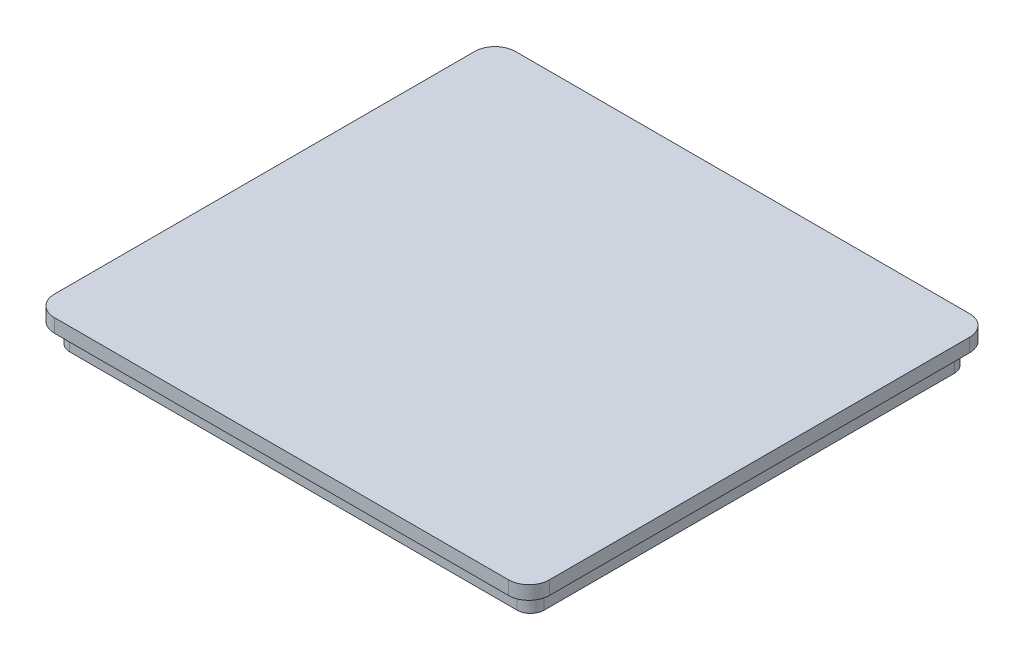
ISO-10303-21;
HEADER;
FILE_DESCRIPTION(('STEP AP214'),'2;1');
FILE_NAME('part.step','',(''),(''),'','','');
FILE_SCHEMA(('AUTOMOTIVE_DESIGN { 1 0 10303 214 1 1 1 1 }'));
ENDSEC;
DATA;
#1=APPLICATION_CONTEXT('core data for automotive mechanical design processes');
#2=APPLICATION_PROTOCOL_DEFINITION('international standard','automotive_design',2000,#1);
#3=PRODUCT_CONTEXT('',#1,'mechanical');
#4=PRODUCT('Part','Part','',(#3));
#5=PRODUCT_RELATED_PRODUCT_CATEGORY('part','',(#4));
#6=PRODUCT_DEFINITION_FORMATION('','',#4);
#7=PRODUCT_DEFINITION_CONTEXT('part definition',#1,'design');
#8=PRODUCT_DEFINITION('design','',#6,#7);
#9=PRODUCT_DEFINITION_SHAPE('','',#8);
#10=(LENGTH_UNIT() NAMED_UNIT(*) SI_UNIT(.MILLI.,.METRE.));
#11=(NAMED_UNIT(*) PLANE_ANGLE_UNIT() SI_UNIT($,.RADIAN.));
#12=(NAMED_UNIT(*) SI_UNIT($,.STERADIAN.) SOLID_ANGLE_UNIT());
#13=UNCERTAINTY_MEASURE_WITH_UNIT(LENGTH_MEASURE(1.E-05),#10,'distance_accuracy_value','');
#14=(GEOMETRIC_REPRESENTATION_CONTEXT(3) GLOBAL_UNCERTAINTY_ASSIGNED_CONTEXT((#13)) GLOBAL_UNIT_ASSIGNED_CONTEXT((#10,
#11,#12)) REPRESENTATION_CONTEXT('',''));
#15=CARTESIAN_POINT('',(0.,0.,0.));
#16=DIRECTION('',(0.,0.,1.));
#17=DIRECTION('',(1.,0.,0.));
#18=AXIS2_PLACEMENT_3D('',#15,#16,#17);
#19=CARTESIAN_POINT('',(-35.,3.,51.2682926829268));
#20=DIRECTION('',(1.,0.,0.));
#21=DIRECTION('',(0.,0.,-1.));
#22=AXIS2_PLACEMENT_3D('',#19,#20,#21);
#23=PLANE('',#22);
#24=DIRECTION('',(0.,0.,1.));
#25=VECTOR('',#24,1.);
#26=CARTESIAN_POINT('',(-35.,3.,51.2682926829268));
#27=LINE('',#26,#25);
#28=CARTESIAN_POINT('',(-35.,3.,-11.2317073170732));
#29=VERTEX_POINT('',#28);
#30=CARTESIAN_POINT('',(-35.,3.,49.2682926829268));
#31=VERTEX_POINT('',#30);
#32=EDGE_CURVE('E266',#29,#31,#27,.T.);
#33=ORIENTED_EDGE('',*,*,#32,.F.);
#34=DIRECTION('',(0.,-1.,0.));
#35=VECTOR('',#34,1.);
#36=CARTESIAN_POINT('',(-35.,3.,-11.2317073170732));
#37=LINE('',#36,#35);
#38=CARTESIAN_POINT('',(-35.,0.,-11.2317073170732));
#39=VERTEX_POINT('',#38);
#40=EDGE_CURVE('E299',#29,#39,#37,.T.);
#41=ORIENTED_EDGE('',*,*,#40,.T.);
#42=DIRECTION('',(0.,0.,1.));
#43=VECTOR('',#42,1.);
#44=CARTESIAN_POINT('',(-35.,0.,51.2682926829268));
#45=LINE('',#44,#43);
#46=CARTESIAN_POINT('',(-35.,0.,49.2682926829268));
#47=VERTEX_POINT('',#46);
#48=EDGE_CURVE('E238',#39,#47,#45,.T.);
#49=ORIENTED_EDGE('',*,*,#48,.T.);
#50=DIRECTION('',(0.,-1.,0.));
#51=VECTOR('',#50,1.);
#52=CARTESIAN_POINT('',(-35.,3.,49.2682926829268));
#53=LINE('',#52,#51);
#54=EDGE_CURVE('E283',#47,#31,#53,.F.);
#55=ORIENTED_EDGE('',*,*,#54,.T.);
#56=EDGE_LOOP('',(#33,#41,#49,#55));
#57=FACE_BOUND('',#56,.T.);
#58=ADVANCED_FACE('F47',(#57),#23,.F.);
#59=CARTESIAN_POINT('',(35.,3.,51.2682926829268));
#60=DIRECTION('',(0.,0.,-1.));
#61=DIRECTION('',(-1.,0.,0.));
#62=AXIS2_PLACEMENT_3D('',#59,#60,#61);
#63=PLANE('',#62);
#64=DIRECTION('',(1.,0.,0.));
#65=VECTOR('',#64,1.);
#66=CARTESIAN_POINT('',(35.,0.,51.2682926829268));
#67=LINE('',#66,#65);
#68=CARTESIAN_POINT('',(-33.,0.,51.2682926829268));
#69=VERTEX_POINT('',#68);
#70=CARTESIAN_POINT('',(33.,0.,51.2682926829268));
#71=VERTEX_POINT('',#70);
#72=EDGE_CURVE('E287',#69,#71,#67,.T.);
#73=ORIENTED_EDGE('',*,*,#72,.T.);
#74=DIRECTION('',(0.,-1.,0.));
#75=VECTOR('',#74,1.);
#76=CARTESIAN_POINT('',(33.,3.,51.2682926829268));
#77=LINE('',#76,#75);
#78=CARTESIAN_POINT('',(33.,3.,51.2682926829268));
#79=VERTEX_POINT('',#78);
#80=EDGE_CURVE('E11',#71,#79,#77,.F.);
#81=ORIENTED_EDGE('',*,*,#80,.T.);
#82=DIRECTION('',(1.,0.,0.));
#83=VECTOR('',#82,1.);
#84=CARTESIAN_POINT('',(35.,3.,51.2682926829268));
#85=LINE('',#84,#83);
#86=CARTESIAN_POINT('',(-33.,3.,51.2682926829268));
#87=VERTEX_POINT('',#86);
#88=EDGE_CURVE('E270',#87,#79,#85,.T.);
#89=ORIENTED_EDGE('',*,*,#88,.F.);
#90=DIRECTION('',(0.,-1.,0.));
#91=VECTOR('',#90,1.);
#92=CARTESIAN_POINT('',(-33.,3.,51.2682926829268));
#93=LINE('',#92,#91);
#94=EDGE_CURVE('E56',#87,#69,#93,.T.);
#95=ORIENTED_EDGE('',*,*,#94,.T.);
#96=EDGE_LOOP('',(#73,#81,#89,#95));
#97=FACE_BOUND('',#96,.T.);
#98=ADVANCED_FACE('F348',(#97),#63,.F.);
#99=CARTESIAN_POINT('',(35.,3.,51.2682926829268));
#100=DIRECTION('',(-1.,0.,0.));
#101=DIRECTION('',(0.,0.,1.));
#102=AXIS2_PLACEMENT_3D('',#99,#100,#101);
#103=PLANE('',#102);
#104=DIRECTION('',(0.,0.,-1.));
#105=VECTOR('',#104,1.);
#106=CARTESIAN_POINT('',(35.,0.,51.2682926829268));
#107=LINE('',#106,#105);
#108=CARTESIAN_POINT('',(35.,0.,49.2682926829268));
#109=VERTEX_POINT('',#108);
#110=CARTESIAN_POINT('',(35.,0.,-11.2317073170732));
#111=VERTEX_POINT('',#110);
#112=EDGE_CURVE('E291',#109,#111,#107,.T.);
#113=ORIENTED_EDGE('',*,*,#112,.T.);
#114=DIRECTION('',(0.,-1.,0.));
#115=VECTOR('',#114,1.);
#116=CARTESIAN_POINT('',(35.,3.,-11.2317073170732));
#117=LINE('',#116,#115);
#118=CARTESIAN_POINT('',(35.,3.,-11.2317073170732));
#119=VERTEX_POINT('',#118);
#120=EDGE_CURVE('E71',#111,#119,#117,.F.);
#121=ORIENTED_EDGE('',*,*,#120,.T.);
#122=DIRECTION('',(0.,0.,-1.));
#123=VECTOR('',#122,1.);
#124=CARTESIAN_POINT('',(35.,3.,51.2682926829268));
#125=LINE('',#124,#123);
#126=CARTESIAN_POINT('',(35.,3.,49.2682926829268));
#127=VERTEX_POINT('',#126);
#128=EDGE_CURVE('E275',#127,#119,#125,.T.);
#129=ORIENTED_EDGE('',*,*,#128,.F.);
#130=DIRECTION('',(0.,-1.,0.));
#131=VECTOR('',#130,1.);
#132=CARTESIAN_POINT('',(35.,3.,49.2682926829268));
#133=LINE('',#132,#131);
#134=EDGE_CURVE('E338',#127,#109,#133,.T.);
#135=ORIENTED_EDGE('',*,*,#134,.T.);
#136=EDGE_LOOP('',(#113,#121,#129,#135));
#137=FACE_BOUND('',#136,.T.);
#138=ADVANCED_FACE('F360',(#137),#103,.F.);
#139=CARTESIAN_POINT('',(35.,3.,-13.2317073170732));
#140=DIRECTION('',(0.,0.,1.));
#141=DIRECTION('',(1.,0.,0.));
#142=AXIS2_PLACEMENT_3D('',#139,#140,#141);
#143=PLANE('',#142);
#144=DIRECTION('',(-1.,0.,0.));
#145=VECTOR('',#144,1.);
#146=CARTESIAN_POINT('',(35.,0.,-13.2317073170732));
#147=LINE('',#146,#145);
#148=CARTESIAN_POINT('',(33.,0.,-13.2317073170732));
#149=VERTEX_POINT('',#148);
#150=CARTESIAN_POINT('',(-33.,0.,-13.2317073170732));
#151=VERTEX_POINT('',#150);
#152=EDGE_CURVE('E271',#149,#151,#147,.T.);
#153=ORIENTED_EDGE('',*,*,#152,.T.);
#154=DIRECTION('',(0.,-1.,0.));
#155=VECTOR('',#154,1.);
#156=CARTESIAN_POINT('',(-33.,3.,-13.2317073170732));
#157=LINE('',#156,#155);
#158=CARTESIAN_POINT('',(-33.,3.,-13.2317073170732));
#159=VERTEX_POINT('',#158);
#160=EDGE_CURVE('E319',#151,#159,#157,.F.);
#161=ORIENTED_EDGE('',*,*,#160,.T.);
#162=DIRECTION('',(-1.,0.,0.));
#163=VECTOR('',#162,1.);
#164=CARTESIAN_POINT('',(35.,3.,-13.2317073170732));
#165=LINE('',#164,#163);
#166=CARTESIAN_POINT('',(33.,3.,-13.2317073170732));
#167=VERTEX_POINT('',#166);
#168=EDGE_CURVE('E279',#167,#159,#165,.T.);
#169=ORIENTED_EDGE('',*,*,#168,.F.);
#170=DIRECTION('',(0.,-1.,0.));
#171=VECTOR('',#170,1.);
#172=CARTESIAN_POINT('',(33.,3.,-13.2317073170732));
#173=LINE('',#172,#171);
#174=EDGE_CURVE('E315',#167,#149,#173,.T.);
#175=ORIENTED_EDGE('',*,*,#174,.T.);
#176=EDGE_LOOP('',(#153,#161,#169,#175));
#177=FACE_BOUND('',#176,.T.);
#178=ADVANCED_FACE('F371',(#177),#143,.F.);
#179=CARTESIAN_POINT('',(0.,0.,0.));
#180=DIRECTION('',(0.,1.,0.));
#181=DIRECTION('',(0.,0.,1.));
#182=AXIS2_PLACEMENT_3D('',#179,#180,#181);
#183=PLANE('',#182);
#184=DIRECTION('',(-1.,0.,0.));
#185=VECTOR('',#184,1.);
#186=CARTESIAN_POINT('',(35.,0.,-11.2317073170732));
#187=LINE('',#186,#185);
#188=CARTESIAN_POINT('',(33.,0.,-11.2317073170732));
#189=VERTEX_POINT('',#188);
#190=CARTESIAN_POINT('',(-33.,0.,-11.2317073170732));
#191=VERTEX_POINT('',#190);
#192=EDGE_CURVE('E247',#189,#191,#187,.T.);
#193=ORIENTED_EDGE('',*,*,#192,.T.);
#194=DIRECTION('',(0.,0.,1.));
#195=VECTOR('',#194,1.);
#196=CARTESIAN_POINT('',(-33.,0.,51.2682926829268));
#197=LINE('',#196,#195);
#198=CARTESIAN_POINT('',(-33.,0.,49.2682926829268));
#199=VERTEX_POINT('',#198);
#200=EDGE_CURVE('E214',#191,#199,#197,.T.);
#201=ORIENTED_EDGE('',*,*,#200,.T.);
#202=DIRECTION('',(1.,0.,0.));
#203=VECTOR('',#202,1.);
#204=CARTESIAN_POINT('',(35.,0.,49.2682926829268));
#205=LINE('',#204,#203);
#206=CARTESIAN_POINT('',(33.,0.,49.2682926829268));
#207=VERTEX_POINT('',#206);
#208=EDGE_CURVE('E219',#199,#207,#205,.T.);
#209=ORIENTED_EDGE('',*,*,#208,.T.);
#210=DIRECTION('',(0.,0.,-1.));
#211=VECTOR('',#210,1.);
#212=CARTESIAN_POINT('',(33.,0.,51.2682926829268));
#213=LINE('',#212,#211);
#214=EDGE_CURVE('E63',#207,#189,#213,.T.);
#215=ORIENTED_EDGE('',*,*,#214,.T.);
#216=EDGE_LOOP('',(#193,#201,#209,#215));
#217=FACE_BOUND('',#216,.T.);
#218=ORIENTED_EDGE('',*,*,#48,.F.);
#219=CARTESIAN_POINT('',(-33.,0.,-11.2317073170732));
#220=DIRECTION('',(0.,1.,0.));
#221=DIRECTION('',(0.,0.,1.));
#222=AXIS2_PLACEMENT_3D('',#219,#220,#221);
#223=CIRCLE('',#222,2.);
#224=EDGE_CURVE('E312',#39,#151,#223,.F.);
#225=ORIENTED_EDGE('',*,*,#224,.T.);
#226=ORIENTED_EDGE('',*,*,#152,.F.);
#227=CARTESIAN_POINT('',(33.,0.,-11.2317073170732));
#228=DIRECTION('',(0.,1.,0.));
#229=DIRECTION('',(0.,0.,1.));
#230=AXIS2_PLACEMENT_3D('',#227,#228,#229);
#231=CIRCLE('',#230,2.);
#232=EDGE_CURVE('E309',#149,#111,#231,.F.);
#233=ORIENTED_EDGE('',*,*,#232,.T.);
#234=ORIENTED_EDGE('',*,*,#112,.F.);
#235=CARTESIAN_POINT('',(33.,0.,49.2682926829268));
#236=DIRECTION('',(0.,1.,0.));
#237=DIRECTION('',(0.,0.,1.));
#238=AXIS2_PLACEMENT_3D('',#235,#236,#237);
#239=CIRCLE('',#238,2.);
#240=EDGE_CURVE('E306',#109,#71,#239,.F.);
#241=ORIENTED_EDGE('',*,*,#240,.T.);
#242=ORIENTED_EDGE('',*,*,#72,.F.);
#243=CARTESIAN_POINT('',(-33.,0.,49.2682926829268));
#244=DIRECTION('',(0.,1.,0.));
#245=DIRECTION('',(0.,0.,1.));
#246=AXIS2_PLACEMENT_3D('',#243,#244,#245);
#247=CIRCLE('',#246,2.);
#248=EDGE_CURVE('E303',#69,#47,#247,.F.);
#249=ORIENTED_EDGE('',*,*,#248,.T.);
#250=EDGE_LOOP('',(#218,#225,#226,#233,#234,#241,#242,#249));
#251=FACE_BOUND('',#250,.T.);
#252=ADVANCED_FACE('F354',(#217,#251),#183,.F.);
#253=CARTESIAN_POINT('',(-33.,3.,-11.2317073170732));
#254=DIRECTION('',(0.,-1.,0.));
#255=DIRECTION('',(0.,0.,-1.));
#256=AXIS2_PLACEMENT_3D('',#253,#254,#255);
#257=CYLINDRICAL_SURFACE('',#256,2.);
#258=CARTESIAN_POINT('',(-33.,3.,-11.2317073170732));
#259=DIRECTION('',(0.,1.,0.));
#260=DIRECTION('',(0.,0.,1.));
#261=AXIS2_PLACEMENT_3D('',#258,#259,#260);
#262=CIRCLE('',#261,2.);
#263=EDGE_CURVE('E334',#159,#29,#262,.T.);
#264=ORIENTED_EDGE('',*,*,#263,.F.);
#265=ORIENTED_EDGE('',*,*,#160,.F.);
#266=ORIENTED_EDGE('',*,*,#224,.F.);
#267=ORIENTED_EDGE('',*,*,#40,.F.);
#268=EDGE_LOOP('',(#264,#265,#266,#267));
#269=FACE_BOUND('',#268,.T.);
#270=ADVANCED_FACE('F374',(#269),#257,.T.);
#271=CARTESIAN_POINT('',(33.,3.,-11.2317073170732));
#272=DIRECTION('',(0.,-1.,0.));
#273=DIRECTION('',(0.,0.,-1.));
#274=AXIS2_PLACEMENT_3D('',#271,#272,#273);
#275=CYLINDRICAL_SURFACE('',#274,2.);
#276=CARTESIAN_POINT('',(33.,3.,-11.2317073170732));
#277=DIRECTION('',(0.,1.,0.));
#278=DIRECTION('',(0.,0.,1.));
#279=AXIS2_PLACEMENT_3D('',#276,#277,#278);
#280=CIRCLE('',#279,2.);
#281=EDGE_CURVE('E330',#119,#167,#280,.T.);
#282=ORIENTED_EDGE('',*,*,#281,.F.);
#283=ORIENTED_EDGE('',*,*,#120,.F.);
#284=ORIENTED_EDGE('',*,*,#232,.F.);
#285=ORIENTED_EDGE('',*,*,#174,.F.);
#286=EDGE_LOOP('',(#282,#283,#284,#285));
#287=FACE_BOUND('',#286,.T.);
#288=ADVANCED_FACE('F376',(#287),#275,.T.);
#289=CARTESIAN_POINT('',(33.,3.,49.2682926829268));
#290=DIRECTION('',(0.,-1.,0.));
#291=DIRECTION('',(0.,0.,-1.));
#292=AXIS2_PLACEMENT_3D('',#289,#290,#291);
#293=CYLINDRICAL_SURFACE('',#292,2.);
#294=CARTESIAN_POINT('',(33.,3.,49.2682926829268));
#295=DIRECTION('',(0.,1.,0.));
#296=DIRECTION('',(0.,0.,1.));
#297=AXIS2_PLACEMENT_3D('',#294,#295,#296);
#298=CIRCLE('',#297,2.);
#299=EDGE_CURVE('E326',#79,#127,#298,.T.);
#300=ORIENTED_EDGE('',*,*,#299,.F.);
#301=ORIENTED_EDGE('',*,*,#80,.F.);
#302=ORIENTED_EDGE('',*,*,#240,.F.);
#303=ORIENTED_EDGE('',*,*,#134,.F.);
#304=EDGE_LOOP('',(#300,#301,#302,#303));
#305=FACE_BOUND('',#304,.T.);
#306=ADVANCED_FACE('F359',(#305),#293,.T.);
#307=CARTESIAN_POINT('',(-33.,3.,49.2682926829268));
#308=DIRECTION('',(0.,-1.,0.));
#309=DIRECTION('',(0.,0.,-1.));
#310=AXIS2_PLACEMENT_3D('',#307,#308,#309);
#311=CYLINDRICAL_SURFACE('',#310,2.);
#312=CARTESIAN_POINT('',(-33.,3.,49.2682926829268));
#313=DIRECTION('',(0.,1.,0.));
#314=DIRECTION('',(0.,0.,1.));
#315=AXIS2_PLACEMENT_3D('',#312,#313,#314);
#316=CIRCLE('',#315,2.);
#317=EDGE_CURVE('E322',#31,#87,#316,.T.);
#318=ORIENTED_EDGE('',*,*,#317,.F.);
#319=ORIENTED_EDGE('',*,*,#54,.F.);
#320=ORIENTED_EDGE('',*,*,#248,.F.);
#321=ORIENTED_EDGE('',*,*,#94,.F.);
#322=EDGE_LOOP('',(#318,#319,#320,#321));
#323=FACE_BOUND('',#322,.T.);
#324=ADVANCED_FACE('F49',(#323),#311,.T.);
#325=CARTESIAN_POINT('',(-33.,3.,51.2682926829268));
#326=DIRECTION('',(1.,0.,0.));
#327=DIRECTION('',(0.,0.,-1.));
#328=AXIS2_PLACEMENT_3D('',#325,#326,#327);
#329=PLANE('',#328);
#330=DIRECTION('',(0.,0.,1.));
#331=VECTOR('',#330,1.);
#332=CARTESIAN_POINT('',(-33.,3.,51.2682926829268));
#333=LINE('',#332,#331);
#334=CARTESIAN_POINT('',(-33.,3.,-11.2317073170732));
#335=VERTEX_POINT('',#334);
#336=CARTESIAN_POINT('',(-33.,3.,49.2682926829268));
#337=VERTEX_POINT('',#336);
#338=EDGE_CURVE('E242',#335,#337,#333,.T.);
#339=ORIENTED_EDGE('',*,*,#338,.T.);
#340=DIRECTION('',(0.,1.,0.));
#341=VECTOR('',#340,1.);
#342=CARTESIAN_POINT('',(-33.,3.,49.2682926829268));
#343=LINE('',#342,#341);
#344=EDGE_CURVE('E230',#199,#337,#343,.T.);
#345=ORIENTED_EDGE('',*,*,#344,.F.);
#346=ORIENTED_EDGE('',*,*,#200,.F.);
#347=DIRECTION('',(0.,1.,0.));
#348=VECTOR('',#347,1.);
#349=CARTESIAN_POINT('',(-33.,3.,-11.2317073170732));
#350=LINE('',#349,#348);
#351=EDGE_CURVE('E225',#191,#335,#350,.T.);
#352=ORIENTED_EDGE('',*,*,#351,.T.);
#353=EDGE_LOOP('',(#339,#345,#346,#352));
#354=FACE_BOUND('',#353,.T.);
#355=ADVANCED_FACE('F407',(#354),#329,.T.);
#356=CARTESIAN_POINT('',(35.,3.,49.2682926829268));
#357=DIRECTION('',(0.,0.,-1.));
#358=DIRECTION('',(-1.,0.,0.));
#359=AXIS2_PLACEMENT_3D('',#356,#357,#358);
#360=PLANE('',#359);
#361=ORIENTED_EDGE('',*,*,#208,.F.);
#362=ORIENTED_EDGE('',*,*,#344,.T.);
#363=DIRECTION('',(1.,0.,0.));
#364=VECTOR('',#363,1.);
#365=CARTESIAN_POINT('',(35.,3.,49.2682926829268));
#366=LINE('',#365,#364);
#367=CARTESIAN_POINT('',(33.,3.,49.2682926829268));
#368=VERTEX_POINT('',#367);
#369=EDGE_CURVE('E246',#337,#368,#366,.T.);
#370=ORIENTED_EDGE('',*,*,#369,.T.);
#371=DIRECTION('',(0.,1.,0.));
#372=VECTOR('',#371,1.);
#373=CARTESIAN_POINT('',(33.,3.,49.2682926829268));
#374=LINE('',#373,#372);
#375=EDGE_CURVE('E235',#207,#368,#374,.T.);
#376=ORIENTED_EDGE('',*,*,#375,.F.);
#377=EDGE_LOOP('',(#361,#362,#370,#376));
#378=FACE_BOUND('',#377,.T.);
#379=ADVANCED_FACE('F404',(#378),#360,.T.);
#380=CARTESIAN_POINT('',(33.,3.,51.2682926829268));
#381=DIRECTION('',(-1.,0.,0.));
#382=DIRECTION('',(0.,0.,1.));
#383=AXIS2_PLACEMENT_3D('',#380,#381,#382);
#384=PLANE('',#383);
#385=ORIENTED_EDGE('',*,*,#214,.F.);
#386=ORIENTED_EDGE('',*,*,#375,.T.);
#387=DIRECTION('',(0.,0.,-1.));
#388=VECTOR('',#387,1.);
#389=CARTESIAN_POINT('',(33.,3.,51.2682926829268));
#390=LINE('',#389,#388);
#391=CARTESIAN_POINT('',(33.,3.,-11.2317073170732));
#392=VERTEX_POINT('',#391);
#393=EDGE_CURVE('E251',#368,#392,#390,.T.);
#394=ORIENTED_EDGE('',*,*,#393,.T.);
#395=DIRECTION('',(0.,1.,0.));
#396=VECTOR('',#395,1.);
#397=CARTESIAN_POINT('',(33.,3.,-11.2317073170732));
#398=LINE('',#397,#396);
#399=EDGE_CURVE('E229',#189,#392,#398,.T.);
#400=ORIENTED_EDGE('',*,*,#399,.F.);
#401=EDGE_LOOP('',(#385,#386,#394,#400));
#402=FACE_BOUND('',#401,.T.);
#403=ADVANCED_FACE('F400',(#402),#384,.T.);
#404=CARTESIAN_POINT('',(35.,3.,-11.2317073170732));
#405=DIRECTION('',(0.,0.,1.));
#406=DIRECTION('',(1.,0.,0.));
#407=AXIS2_PLACEMENT_3D('',#404,#405,#406);
#408=PLANE('',#407);
#409=ORIENTED_EDGE('',*,*,#192,.F.);
#410=ORIENTED_EDGE('',*,*,#399,.T.);
#411=DIRECTION('',(-1.,0.,0.));
#412=VECTOR('',#411,1.);
#413=CARTESIAN_POINT('',(35.,3.,-11.2317073170732));
#414=LINE('',#413,#412);
#415=EDGE_CURVE('E234',#392,#335,#414,.T.);
#416=ORIENTED_EDGE('',*,*,#415,.T.);
#417=ORIENTED_EDGE('',*,*,#351,.F.);
#418=EDGE_LOOP('',(#409,#410,#416,#417));
#419=FACE_BOUND('',#418,.T.);
#420=ADVANCED_FACE('F397',(#419),#408,.T.);
#421=CARTESIAN_POINT('',(33.5,3.,-11.9817073170732));
#422=DIRECTION('',(0.,1.,0.));
#423=DIRECTION('',(0.,0.,1.));
#424=AXIS2_PLACEMENT_3D('',#421,#422,#423);
#425=PLANE('',#424);
#426=ORIENTED_EDGE('',*,*,#281,.T.);
#427=ORIENTED_EDGE('',*,*,#168,.T.);
#428=ORIENTED_EDGE('',*,*,#263,.T.);
#429=ORIENTED_EDGE('',*,*,#32,.T.);
#430=ORIENTED_EDGE('',*,*,#317,.T.);
#431=ORIENTED_EDGE('',*,*,#88,.T.);
#432=ORIENTED_EDGE('',*,*,#299,.T.);
#433=ORIENTED_EDGE('',*,*,#128,.T.);
#434=EDGE_LOOP('',(#426,#427,#428,#429,#430,#431,#432,#433));
#435=FACE_BOUND('',#434,.T.);
#436=CARTESIAN_POINT('',(33.5,3.,-11.9817073170732));
#437=DIRECTION('',(0.,1.,0.));
#438=DIRECTION('',(0.,0.,1.));
#439=AXIS2_PLACEMENT_3D('',#436,#437,#438);
#440=CIRCLE('',#439,3.);
#441=CARTESIAN_POINT('',(36.5,3.,-11.9817073170732));
#442=VERTEX_POINT('',#441);
#443=CARTESIAN_POINT('',(33.5,3.,-14.9817073170732));
#444=VERTEX_POINT('',#443);
#445=EDGE_CURVE('E212',#442,#444,#440,.T.);
#446=ORIENTED_EDGE('',*,*,#445,.F.);
#447=DIRECTION('',(0.,0.,-1.));
#448=VECTOR('',#447,1.);
#449=CARTESIAN_POINT('',(36.5,3.,50.0182926829268));
#450=LINE('',#449,#448);
#451=CARTESIAN_POINT('',(36.5,3.,50.0182926829268));
#452=VERTEX_POINT('',#451);
#453=EDGE_CURVE('E208',#452,#442,#450,.T.);
#454=ORIENTED_EDGE('',*,*,#453,.F.);
#455=CARTESIAN_POINT('',(33.5,3.,50.0182926829268));
#456=DIRECTION('',(0.,1.,0.));
#457=DIRECTION('',(0.,0.,1.));
#458=AXIS2_PLACEMENT_3D('',#455,#456,#457);
#459=CIRCLE('',#458,3.);
#460=CARTESIAN_POINT('',(33.5,3.,53.0182926829268));
#461=VERTEX_POINT('',#460);
#462=EDGE_CURVE('E598',#461,#452,#459,.T.);
#463=ORIENTED_EDGE('',*,*,#462,.F.);
#464=DIRECTION('',(1.,0.,0.));
#465=VECTOR('',#464,1.);
#466=CARTESIAN_POINT('',(33.5,3.,53.0182926829268));
#467=LINE('',#466,#465);
#468=CARTESIAN_POINT('',(-33.5,3.,53.0182926829268));
#469=VERTEX_POINT('',#468);
#470=EDGE_CURVE('E620',#469,#461,#467,.T.);
#471=ORIENTED_EDGE('',*,*,#470,.F.);
#472=CARTESIAN_POINT('',(-33.5,3.,50.0182926829268));
#473=DIRECTION('',(0.,1.,0.));
#474=DIRECTION('',(0.,0.,-1.));
#475=AXIS2_PLACEMENT_3D('',#472,#473,#474);
#476=CIRCLE('',#475,3.);
#477=CARTESIAN_POINT('',(-36.5,3.,50.0182926829268));
#478=VERTEX_POINT('',#477);
#479=EDGE_CURVE('E617',#478,#469,#476,.T.);
#480=ORIENTED_EDGE('',*,*,#479,.F.);
#481=DIRECTION('',(0.,0.,1.));
#482=VECTOR('',#481,1.);
#483=CARTESIAN_POINT('',(-36.5,3.,50.0182926829268));
#484=LINE('',#483,#482);
#485=CARTESIAN_POINT('',(-36.5,3.,-11.9817073170732));
#486=VERTEX_POINT('',#485);
#487=EDGE_CURVE('E614',#486,#478,#484,.T.);
#488=ORIENTED_EDGE('',*,*,#487,.F.);
#489=CARTESIAN_POINT('',(-33.5,3.,-11.9817073170732));
#490=DIRECTION('',(0.,1.,0.));
#491=DIRECTION('',(0.,0.,1.));
#492=AXIS2_PLACEMENT_3D('',#489,#490,#491);
#493=CIRCLE('',#492,3.);
#494=CARTESIAN_POINT('',(-33.5,3.,-14.9817073170732));
#495=VERTEX_POINT('',#494);
#496=EDGE_CURVE('E607',#495,#486,#493,.T.);
#497=ORIENTED_EDGE('',*,*,#496,.F.);
#498=DIRECTION('',(-1.,0.,0.));
#499=VECTOR('',#498,1.);
#500=CARTESIAN_POINT('',(33.5,3.,-14.9817073170732));
#501=LINE('',#500,#499);
#502=EDGE_CURVE('E603',#444,#495,#501,.T.);
#503=ORIENTED_EDGE('',*,*,#502,.F.);
#504=EDGE_LOOP('',(#446,#454,#463,#471,#480,#488,#497,#503));
#505=FACE_BOUND('',#504,.T.);
#506=ADVANCED_FACE('F362',(#435,#505),#425,.F.);
#507=CARTESIAN_POINT('',(33.5,5.,-11.9817073170732));
#508=DIRECTION('',(0.,1.,0.));
#509=DIRECTION('',(0.,0.,1.));
#510=AXIS2_PLACEMENT_3D('',#507,#508,#509);
#511=PLANE('',#510);
#512=CARTESIAN_POINT('',(33.5,5.,-11.9817073170732));
#513=DIRECTION('',(0.,1.,0.));
#514=DIRECTION('',(0.,0.,1.));
#515=AXIS2_PLACEMENT_3D('',#512,#513,#514);
#516=CIRCLE('',#515,3.);
#517=CARTESIAN_POINT('',(36.5,5.,-11.9817073170732));
#518=VERTEX_POINT('',#517);
#519=CARTESIAN_POINT('',(33.5,5.,-14.9817073170732));
#520=VERTEX_POINT('',#519);
#521=EDGE_CURVE('E198',#518,#520,#516,.T.);
#522=ORIENTED_EDGE('',*,*,#521,.T.);
#523=DIRECTION('',(-1.,0.,0.));
#524=VECTOR('',#523,1.);
#525=CARTESIAN_POINT('',(33.5,5.,-14.9817073170732));
#526=LINE('',#525,#524);
#527=CARTESIAN_POINT('',(-33.5,5.,-14.9817073170732));
#528=VERTEX_POINT('',#527);
#529=EDGE_CURVE('E186',#520,#528,#526,.T.);
#530=ORIENTED_EDGE('',*,*,#529,.T.);
#531=CARTESIAN_POINT('',(-33.5,5.,-11.9817073170732));
#532=DIRECTION('',(0.,1.,0.));
#533=DIRECTION('',(0.,0.,1.));
#534=AXIS2_PLACEMENT_3D('',#531,#532,#533);
#535=CIRCLE('',#534,3.);
#536=CARTESIAN_POINT('',(-36.5,5.,-11.9817073170732));
#537=VERTEX_POINT('',#536);
#538=EDGE_CURVE('E197',#528,#537,#535,.T.);
#539=ORIENTED_EDGE('',*,*,#538,.T.);
#540=DIRECTION('',(0.,0.,1.));
#541=VECTOR('',#540,1.);
#542=CARTESIAN_POINT('',(-36.5,5.,50.0182926829268));
#543=LINE('',#542,#541);
#544=CARTESIAN_POINT('',(-36.5,5.,50.0182926829268));
#545=VERTEX_POINT('',#544);
#546=EDGE_CURVE('E644',#537,#545,#543,.T.);
#547=ORIENTED_EDGE('',*,*,#546,.T.);
#548=CARTESIAN_POINT('',(-33.5,5.,50.0182926829268));
#549=DIRECTION('',(0.,1.,0.));
#550=DIRECTION('',(0.,0.,-1.));
#551=AXIS2_PLACEMENT_3D('',#548,#549,#550);
#552=CIRCLE('',#551,3.);
#553=CARTESIAN_POINT('',(-33.5,5.,53.0182926829268));
#554=VERTEX_POINT('',#553);
#555=EDGE_CURVE('E655',#545,#554,#552,.T.);
#556=ORIENTED_EDGE('',*,*,#555,.T.);
#557=DIRECTION('',(1.,0.,0.));
#558=VECTOR('',#557,1.);
#559=CARTESIAN_POINT('',(33.5,5.,53.0182926829268));
#560=LINE('',#559,#558);
#561=CARTESIAN_POINT('',(33.5,5.,53.0182926829268));
#562=VERTEX_POINT('',#561);
#563=EDGE_CURVE('E651',#554,#562,#560,.T.);
#564=ORIENTED_EDGE('',*,*,#563,.T.);
#565=CARTESIAN_POINT('',(33.5,5.,50.0182926829268));
#566=DIRECTION('',(0.,1.,0.));
#567=DIRECTION('',(0.,0.,1.));
#568=AXIS2_PLACEMENT_3D('',#565,#566,#567);
#569=CIRCLE('',#568,3.);
#570=CARTESIAN_POINT('',(36.5,5.,50.0182926829268));
#571=VERTEX_POINT('',#570);
#572=EDGE_CURVE('E654',#562,#571,#569,.T.);
#573=ORIENTED_EDGE('',*,*,#572,.T.);
#574=DIRECTION('',(0.,0.,-1.));
#575=VECTOR('',#574,1.);
#576=CARTESIAN_POINT('',(36.5,5.,50.0182926829268));
#577=LINE('',#576,#575);
#578=EDGE_CURVE('E203',#571,#518,#577,.T.);
#579=ORIENTED_EDGE('',*,*,#578,.T.);
#580=EDGE_LOOP('',(#522,#530,#539,#547,#556,#564,#573,#579));
#581=FACE_BOUND('',#580,.T.);
#582=ADVANCED_FACE('F201',(#581),#511,.T.);
#583=CARTESIAN_POINT('',(36.5,5.,50.0182926829268));
#584=DIRECTION('',(-1.,0.,0.));
#585=DIRECTION('',(0.,0.,1.));
#586=AXIS2_PLACEMENT_3D('',#583,#584,#585);
#587=PLANE('',#586);
#588=ORIENTED_EDGE('',*,*,#453,.T.);
#589=DIRECTION('',(0.,-1.,0.));
#590=VECTOR('',#589,1.);
#591=CARTESIAN_POINT('',(36.5,5.,-11.9817073170732));
#592=LINE('',#591,#590);
#593=EDGE_CURVE('E593',#518,#442,#592,.T.);
#594=ORIENTED_EDGE('',*,*,#593,.F.);
#595=ORIENTED_EDGE('',*,*,#578,.F.);
#596=DIRECTION('',(0.,-1.,0.));
#597=VECTOR('',#596,1.);
#598=CARTESIAN_POINT('',(36.5,5.,50.0182926829268));
#599=LINE('',#598,#597);
#600=EDGE_CURVE('E595',#571,#452,#599,.T.);
#601=ORIENTED_EDGE('',*,*,#600,.T.);
#602=EDGE_LOOP('',(#588,#594,#595,#601));
#603=FACE_BOUND('',#602,.T.);
#604=ADVANCED_FACE('F436',(#603),#587,.F.);
#605=CARTESIAN_POINT('',(33.5,5.,50.0182926829268));
#606=DIRECTION('',(0.,-1.,0.));
#607=DIRECTION('',(0.,0.,-1.));
#608=AXIS2_PLACEMENT_3D('',#605,#606,#607);
#609=CYLINDRICAL_SURFACE('',#608,3.);
#610=ORIENTED_EDGE('',*,*,#462,.T.);
#611=ORIENTED_EDGE('',*,*,#600,.F.);
#612=ORIENTED_EDGE('',*,*,#572,.F.);
#613=DIRECTION('',(0.,-1.,0.));
#614=VECTOR('',#613,1.);
#615=CARTESIAN_POINT('',(33.5,5.,53.0182926829268));
#616=LINE('',#615,#614);
#617=EDGE_CURVE('E627',#562,#461,#616,.T.);
#618=ORIENTED_EDGE('',*,*,#617,.T.);
#619=EDGE_LOOP('',(#610,#611,#612,#618));
#620=FACE_BOUND('',#619,.T.);
#621=ADVANCED_FACE('F432',(#620),#609,.T.);
#622=CARTESIAN_POINT('',(33.5,5.,53.0182926829268));
#623=DIRECTION('',(0.,0.,-1.));
#624=DIRECTION('',(-1.,0.,0.));
#625=AXIS2_PLACEMENT_3D('',#622,#623,#624);
#626=PLANE('',#625);
#627=ORIENTED_EDGE('',*,*,#470,.T.);
#628=ORIENTED_EDGE('',*,*,#617,.F.);
#629=ORIENTED_EDGE('',*,*,#563,.F.);
#630=DIRECTION('',(0.,-1.,0.));
#631=VECTOR('',#630,1.);
#632=CARTESIAN_POINT('',(-33.5,5.,53.0182926829268));
#633=LINE('',#632,#631);
#634=EDGE_CURVE('E631',#554,#469,#633,.T.);
#635=ORIENTED_EDGE('',*,*,#634,.T.);
#636=EDGE_LOOP('',(#627,#628,#629,#635));
#637=FACE_BOUND('',#636,.T.);
#638=ADVANCED_FACE('F428',(#637),#626,.F.);
#639=CARTESIAN_POINT('',(-33.5,5.,50.0182926829268));
#640=DIRECTION('',(0.,-1.,0.));
#641=DIRECTION('',(0.,0.,-1.));
#642=AXIS2_PLACEMENT_3D('',#639,#640,#641);
#643=CYLINDRICAL_SURFACE('',#642,3.);
#644=ORIENTED_EDGE('',*,*,#479,.T.);
#645=ORIENTED_EDGE('',*,*,#634,.F.);
#646=ORIENTED_EDGE('',*,*,#555,.F.);
#647=DIRECTION('',(0.,-1.,0.));
#648=VECTOR('',#647,1.);
#649=CARTESIAN_POINT('',(-36.5,5.,50.0182926829268));
#650=LINE('',#649,#648);
#651=EDGE_CURVE('E635',#545,#478,#650,.T.);
#652=ORIENTED_EDGE('',*,*,#651,.T.);
#653=EDGE_LOOP('',(#644,#645,#646,#652));
#654=FACE_BOUND('',#653,.T.);
#655=ADVANCED_FACE('F424',(#654),#643,.T.);
#656=CARTESIAN_POINT('',(-36.5,5.,50.0182926829268));
#657=DIRECTION('',(1.,0.,0.));
#658=DIRECTION('',(0.,0.,-1.));
#659=AXIS2_PLACEMENT_3D('',#656,#657,#658);
#660=PLANE('',#659);
#661=ORIENTED_EDGE('',*,*,#487,.T.);
#662=ORIENTED_EDGE('',*,*,#651,.F.);
#663=ORIENTED_EDGE('',*,*,#546,.F.);
#664=DIRECTION('',(0.,-1.,0.));
#665=VECTOR('',#664,1.);
#666=CARTESIAN_POINT('',(-36.5,5.,-11.9817073170732));
#667=LINE('',#666,#665);
#668=EDGE_CURVE('E221',#537,#486,#667,.T.);
#669=ORIENTED_EDGE('',*,*,#668,.T.);
#670=EDGE_LOOP('',(#661,#662,#663,#669));
#671=FACE_BOUND('',#670,.T.);
#672=ADVANCED_FACE('F420',(#671),#660,.F.);
#673=CARTESIAN_POINT('',(-33.5,5.,-11.9817073170732));
#674=DIRECTION('',(0.,-1.,0.));
#675=DIRECTION('',(0.,0.,-1.));
#676=AXIS2_PLACEMENT_3D('',#673,#674,#675);
#677=CYLINDRICAL_SURFACE('',#676,3.);
#678=ORIENTED_EDGE('',*,*,#496,.T.);
#679=ORIENTED_EDGE('',*,*,#668,.F.);
#680=ORIENTED_EDGE('',*,*,#538,.F.);
#681=DIRECTION('',(0.,-1.,0.));
#682=VECTOR('',#681,1.);
#683=CARTESIAN_POINT('',(-33.5,5.,-14.9817073170732));
#684=LINE('',#683,#682);
#685=EDGE_CURVE('E193',#528,#495,#684,.T.);
#686=ORIENTED_EDGE('',*,*,#685,.T.);
#687=EDGE_LOOP('',(#678,#679,#680,#686));
#688=FACE_BOUND('',#687,.T.);
#689=ADVANCED_FACE('F417',(#688),#677,.T.);
#690=CARTESIAN_POINT('',(33.5,5.,-14.9817073170732));
#691=DIRECTION('',(0.,0.,1.));
#692=DIRECTION('',(1.,0.,0.));
#693=AXIS2_PLACEMENT_3D('',#690,#691,#692);
#694=PLANE('',#693);
#695=ORIENTED_EDGE('',*,*,#502,.T.);
#696=ORIENTED_EDGE('',*,*,#685,.F.);
#697=ORIENTED_EDGE('',*,*,#529,.F.);
#698=DIRECTION('',(0.,-1.,0.));
#699=VECTOR('',#698,1.);
#700=CARTESIAN_POINT('',(33.5,5.,-14.9817073170732));
#701=LINE('',#700,#699);
#702=EDGE_CURVE('E190',#520,#444,#701,.T.);
#703=ORIENTED_EDGE('',*,*,#702,.T.);
#704=EDGE_LOOP('',(#695,#696,#697,#703));
#705=FACE_BOUND('',#704,.T.);
#706=ADVANCED_FACE('F188',(#705),#694,.F.);
#707=CARTESIAN_POINT('',(33.5,5.,-11.9817073170732));
#708=DIRECTION('',(0.,-1.,0.));
#709=DIRECTION('',(0.,0.,-1.));
#710=AXIS2_PLACEMENT_3D('',#707,#708,#709);
#711=CYLINDRICAL_SURFACE('',#710,3.);
#712=ORIENTED_EDGE('',*,*,#445,.T.);
#713=ORIENTED_EDGE('',*,*,#702,.F.);
#714=ORIENTED_EDGE('',*,*,#521,.F.);
#715=ORIENTED_EDGE('',*,*,#593,.T.);
#716=EDGE_LOOP('',(#712,#713,#714,#715));
#717=FACE_BOUND('',#716,.T.);
#718=ADVANCED_FACE('F210',(#717),#711,.T.);
#719=ORIENTED_EDGE('',*,*,#415,.F.);
#720=ORIENTED_EDGE('',*,*,#393,.F.);
#721=ORIENTED_EDGE('',*,*,#369,.F.);
#722=ORIENTED_EDGE('',*,*,#338,.F.);
#723=EDGE_LOOP('',(#719,#720,#721,#722));
#724=FACE_BOUND('',#723,.T.);
#725=ADVANCED_FACE('F414',(#724),#425,.F.);
#726=CLOSED_SHELL('',(#58,#98,#138,#178,#252,#270,#288,#306,#324,#355,#379,#403,#420,#506,#582,
#604,#621,#638,#655,#672,#689,#706,#718,#725));
#727=MANIFOLD_SOLID_BREP('B2',#726);
#728=ADVANCED_BREP_SHAPE_REPRESENTATION('',(#18,#727),#14);
#729=SHAPE_DEFINITION_REPRESENTATION(#9,#728);
ENDSEC;
END-ISO-10303-21;
